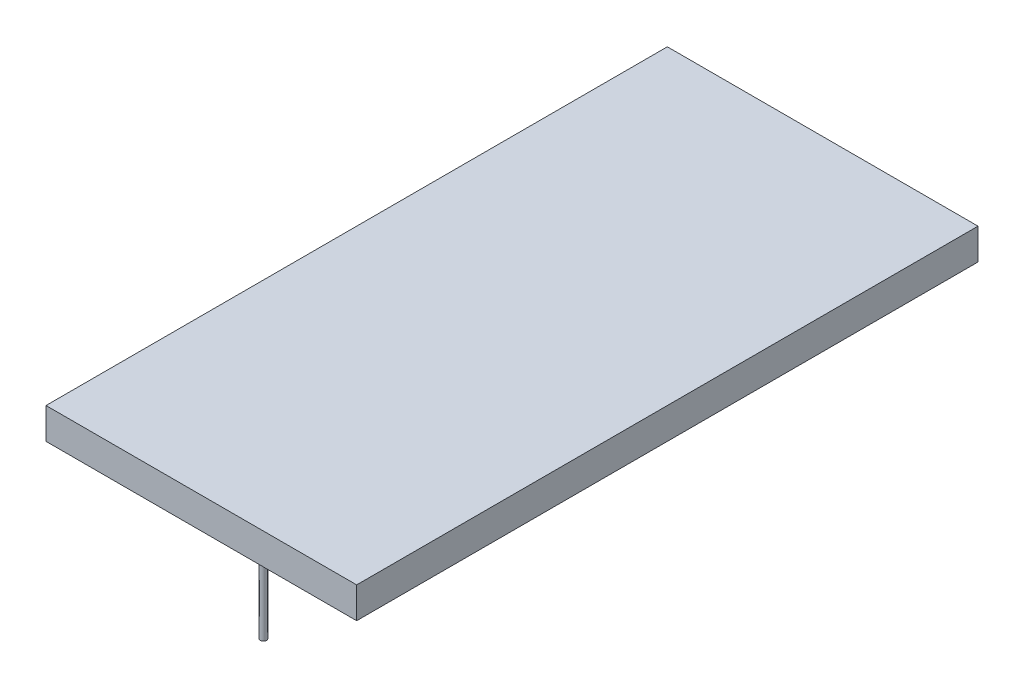
ISO-10303-21;
HEADER;
FILE_DESCRIPTION(('STEP AP214'),'2;1');
FILE_NAME('part.step','',(''),(''),'','','');
FILE_SCHEMA(('AUTOMOTIVE_DESIGN { 1 0 10303 214 1 1 1 1 }'));
ENDSEC;
DATA;
#1=APPLICATION_CONTEXT('core data for automotive mechanical design processes');
#2=APPLICATION_PROTOCOL_DEFINITION('international standard','automotive_design',2000,#1);
#3=PRODUCT_CONTEXT('',#1,'mechanical');
#4=PRODUCT('Part','Part','',(#3));
#5=PRODUCT_RELATED_PRODUCT_CATEGORY('part','',(#4));
#6=PRODUCT_DEFINITION_FORMATION('','',#4);
#7=PRODUCT_DEFINITION_CONTEXT('part definition',#1,'design');
#8=PRODUCT_DEFINITION('design','',#6,#7);
#9=PRODUCT_DEFINITION_SHAPE('','',#8);
#10=(LENGTH_UNIT() NAMED_UNIT(*) SI_UNIT(.MILLI.,.METRE.));
#11=(NAMED_UNIT(*) PLANE_ANGLE_UNIT() SI_UNIT($,.RADIAN.));
#12=(NAMED_UNIT(*) SI_UNIT($,.STERADIAN.) SOLID_ANGLE_UNIT());
#13=UNCERTAINTY_MEASURE_WITH_UNIT(LENGTH_MEASURE(1.E-05),#10,'distance_accuracy_value','');
#14=(GEOMETRIC_REPRESENTATION_CONTEXT(3) GLOBAL_UNCERTAINTY_ASSIGNED_CONTEXT((#13)) GLOBAL_UNIT_ASSIGNED_CONTEXT((#10,
#11,#12)) REPRESENTATION_CONTEXT('',''));
#15=CARTESIAN_POINT('',(0.,0.,0.));
#16=DIRECTION('',(0.,0.,1.));
#17=DIRECTION('',(1.,0.,0.));
#18=AXIS2_PLACEMENT_3D('',#15,#16,#17);
#19=CARTESIAN_POINT('',(250.,-25.,500.));
#20=DIRECTION('',(1.,0.,0.));
#21=DIRECTION('',(0.,0.,-1.));
#22=AXIS2_PLACEMENT_3D('',#19,#20,#21);
#23=PLANE('',#22);
#24=DIRECTION('',(0.,0.,-1.));
#25=VECTOR('',#24,1.);
#26=CARTESIAN_POINT('',(250.,0.,500.));
#27=LINE('',#26,#25);
#28=CARTESIAN_POINT('',(250.,0.,500.));
#29=VERTEX_POINT('',#28);
#30=CARTESIAN_POINT('',(250.,0.,0.));
#31=VERTEX_POINT('',#30);
#32=EDGE_CURVE('E82',#29,#31,#27,.T.);
#33=ORIENTED_EDGE('',*,*,#32,.F.);
#34=DIRECTION('',(0.,1.,0.));
#35=VECTOR('',#34,1.);
#36=CARTESIAN_POINT('',(250.,-25.,500.));
#37=LINE('',#36,#35);
#38=CARTESIAN_POINT('',(250.,-25.,500.));
#39=VERTEX_POINT('',#38);
#40=EDGE_CURVE('E30',#39,#29,#37,.T.);
#41=ORIENTED_EDGE('',*,*,#40,.F.);
#42=DIRECTION('',(0.,0.,-1.));
#43=VECTOR('',#42,1.);
#44=CARTESIAN_POINT('',(250.,-25.,500.));
#45=LINE('',#44,#43);
#46=CARTESIAN_POINT('',(250.,-25.,0.));
#47=VERTEX_POINT('',#46);
#48=EDGE_CURVE('E69',#39,#47,#45,.T.);
#49=ORIENTED_EDGE('',*,*,#48,.T.);
#50=DIRECTION('',(0.,1.,0.));
#51=VECTOR('',#50,1.);
#52=CARTESIAN_POINT('',(250.,-25.,0.));
#53=LINE('',#52,#51);
#54=EDGE_CURVE('E9',#47,#31,#53,.T.);
#55=ORIENTED_EDGE('',*,*,#54,.T.);
#56=EDGE_LOOP('',(#33,#41,#49,#55));
#57=FACE_BOUND('',#56,.T.);
#58=ADVANCED_FACE('F14',(#57),#23,.T.);
#59=CARTESIAN_POINT('',(250.,-25.,0.));
#60=DIRECTION('',(0.,0.,-1.));
#61=DIRECTION('',(-1.,0.,0.));
#62=AXIS2_PLACEMENT_3D('',#59,#60,#61);
#63=PLANE('',#62);
#64=DIRECTION('',(-1.,0.,0.));
#65=VECTOR('',#64,1.);
#66=CARTESIAN_POINT('',(250.,0.,0.));
#67=LINE('',#66,#65);
#68=CARTESIAN_POINT('',(0.,0.,0.));
#69=VERTEX_POINT('',#68);
#70=EDGE_CURVE('E79',#31,#69,#67,.T.);
#71=ORIENTED_EDGE('',*,*,#70,.F.);
#72=ORIENTED_EDGE('',*,*,#54,.F.);
#73=DIRECTION('',(-1.,0.,0.));
#74=VECTOR('',#73,1.);
#75=CARTESIAN_POINT('',(250.,-25.,0.));
#76=LINE('',#75,#74);
#77=CARTESIAN_POINT('',(0.,-25.,0.));
#78=VERTEX_POINT('',#77);
#79=EDGE_CURVE('E65',#47,#78,#76,.T.);
#80=ORIENTED_EDGE('',*,*,#79,.T.);
#81=DIRECTION('',(0.,1.,0.));
#82=VECTOR('',#81,1.);
#83=CARTESIAN_POINT('',(0.,-25.,0.));
#84=LINE('',#83,#82);
#85=EDGE_CURVE('E22',#78,#69,#84,.T.);
#86=ORIENTED_EDGE('',*,*,#85,.T.);
#87=EDGE_LOOP('',(#71,#72,#80,#86));
#88=FACE_BOUND('',#87,.T.);
#89=ADVANCED_FACE('F66',(#88),#63,.T.);
#90=CARTESIAN_POINT('',(0.,-25.,0.));
#91=DIRECTION('',(-1.,0.,0.));
#92=DIRECTION('',(0.,0.,1.));
#93=AXIS2_PLACEMENT_3D('',#90,#91,#92);
#94=PLANE('',#93);
#95=DIRECTION('',(0.,0.,1.));
#96=VECTOR('',#95,1.);
#97=CARTESIAN_POINT('',(0.,0.,0.));
#98=LINE('',#97,#96);
#99=CARTESIAN_POINT('',(0.,0.,500.));
#100=VERTEX_POINT('',#99);
#101=EDGE_CURVE('E63',#69,#100,#98,.T.);
#102=ORIENTED_EDGE('',*,*,#101,.F.);
#103=ORIENTED_EDGE('',*,*,#85,.F.);
#104=DIRECTION('',(0.,0.,1.));
#105=VECTOR('',#104,1.);
#106=CARTESIAN_POINT('',(0.,-25.,0.));
#107=LINE('',#106,#105);
#108=CARTESIAN_POINT('',(0.,-25.,500.));
#109=VERTEX_POINT('',#108);
#110=EDGE_CURVE('E60',#78,#109,#107,.T.);
#111=ORIENTED_EDGE('',*,*,#110,.T.);
#112=DIRECTION('',(0.,1.,0.));
#113=VECTOR('',#112,1.);
#114=CARTESIAN_POINT('',(0.,-25.,500.));
#115=LINE('',#114,#113);
#116=EDGE_CURVE('E46',#109,#100,#115,.T.);
#117=ORIENTED_EDGE('',*,*,#116,.T.);
#118=EDGE_LOOP('',(#102,#103,#111,#117));
#119=FACE_BOUND('',#118,.T.);
#120=ADVANCED_FACE('F58',(#119),#94,.T.);
#121=CARTESIAN_POINT('',(0.,-25.,500.));
#122=DIRECTION('',(0.,0.,1.));
#123=DIRECTION('',(1.,0.,0.));
#124=AXIS2_PLACEMENT_3D('',#121,#122,#123);
#125=PLANE('',#124);
#126=DIRECTION('',(1.,0.,0.));
#127=VECTOR('',#126,1.);
#128=CARTESIAN_POINT('',(0.,0.,500.));
#129=LINE('',#128,#127);
#130=EDGE_CURVE('E78',#100,#29,#129,.T.);
#131=ORIENTED_EDGE('',*,*,#130,.F.);
#132=ORIENTED_EDGE('',*,*,#116,.F.);
#133=DIRECTION('',(1.,0.,0.));
#134=VECTOR('',#133,1.);
#135=CARTESIAN_POINT('',(0.,-25.,500.));
#136=LINE('',#135,#134);
#137=EDGE_CURVE('E72',#109,#39,#136,.T.);
#138=ORIENTED_EDGE('',*,*,#137,.T.);
#139=ORIENTED_EDGE('',*,*,#40,.T.);
#140=EDGE_LOOP('',(#131,#132,#138,#139));
#141=FACE_BOUND('',#140,.T.);
#142=ADVANCED_FACE('F124',(#141),#125,.T.);
#143=CARTESIAN_POINT('',(0.,-25.,0.));
#144=DIRECTION('',(0.,1.,0.));
#145=DIRECTION('',(0.,0.,1.));
#146=AXIS2_PLACEMENT_3D('',#143,#144,#145);
#147=PLANE('',#146);
#148=CARTESIAN_POINT('',(125.,-25.,450.));
#149=DIRECTION('',(0.,1.,0.));
#150=DIRECTION('',(1.,0.,0.));
#151=AXIS2_PLACEMENT_3D('',#148,#149,#150);
#152=CIRCLE('',#151,2.5);
#153=CARTESIAN_POINT('',(127.5,-25.,450.));
#154=VERTEX_POINT('',#153);
#155=EDGE_CURVE('E97',#154,#154,#152,.T.);
#156=ORIENTED_EDGE('',*,*,#155,.T.);
#157=EDGE_LOOP('',(#156));
#158=FACE_BOUND('',#157,.T.);
#159=ORIENTED_EDGE('',*,*,#48,.F.);
#160=ORIENTED_EDGE('',*,*,#137,.F.);
#161=ORIENTED_EDGE('',*,*,#110,.F.);
#162=ORIENTED_EDGE('',*,*,#79,.F.);
#163=EDGE_LOOP('',(#159,#160,#161,#162));
#164=FACE_BOUND('',#163,.T.);
#165=ADVANCED_FACE('F71',(#158,#164),#147,.F.);
#166=CARTESIAN_POINT('',(0.,0.,0.));
#167=DIRECTION('',(0.,1.,0.));
#168=DIRECTION('',(0.,0.,1.));
#169=AXIS2_PLACEMENT_3D('',#166,#167,#168);
#170=PLANE('',#169);
#171=ORIENTED_EDGE('',*,*,#32,.T.);
#172=ORIENTED_EDGE('',*,*,#70,.T.);
#173=ORIENTED_EDGE('',*,*,#101,.T.);
#174=ORIENTED_EDGE('',*,*,#130,.T.);
#175=EDGE_LOOP('',(#171,#172,#173,#174));
#176=FACE_BOUND('',#175,.T.);
#177=ADVANCED_FACE('F109',(#176),#170,.T.);
#178=CARTESIAN_POINT('',(125.,-125.,450.));
#179=DIRECTION('',(0.,1.,0.));
#180=DIRECTION('',(0.,0.,1.));
#181=AXIS2_PLACEMENT_3D('',#178,#179,#180);
#182=CYLINDRICAL_SURFACE('',#181,2.5);
#183=CARTESIAN_POINT('',(125.,-125.,450.));
#184=DIRECTION('',(0.,1.,0.));
#185=DIRECTION('',(1.,0.,0.));
#186=AXIS2_PLACEMENT_3D('',#183,#184,#185);
#187=CIRCLE('',#186,2.5);
#188=CARTESIAN_POINT('',(127.5,-125.,450.));
#189=VERTEX_POINT('',#188);
#190=EDGE_CURVE('E90',#189,#189,#187,.T.);
#191=ORIENTED_EDGE('',*,*,#190,.T.);
#192=EDGE_LOOP('',(#191));
#193=FACE_BOUND('',#192,.T.);
#194=ORIENTED_EDGE('',*,*,#155,.F.);
#195=EDGE_LOOP('',(#194));
#196=FACE_BOUND('',#195,.T.);
#197=ADVANCED_FACE('F106',(#193,#196),#182,.T.);
#198=CARTESIAN_POINT('',(125.,-125.,450.));
#199=DIRECTION('',(0.,1.,0.));
#200=DIRECTION('',(0.,0.,1.));
#201=AXIS2_PLACEMENT_3D('',#198,#199,#200);
#202=PLANE('',#201);
#203=ORIENTED_EDGE('',*,*,#190,.F.);
#204=EDGE_LOOP('',(#203));
#205=FACE_BOUND('',#204,.T.);
#206=ADVANCED_FACE('F108',(#205),#202,.F.);
#207=CLOSED_SHELL('',(#58,#89,#120,#142,#165,#177,#197,#206));
#208=MANIFOLD_SOLID_BREP('B1',#207);
#209=ADVANCED_BREP_SHAPE_REPRESENTATION('',(#18,#208),#14);
#210=SHAPE_DEFINITION_REPRESENTATION(#9,#209);
ENDSEC;
END-ISO-10303-21;
